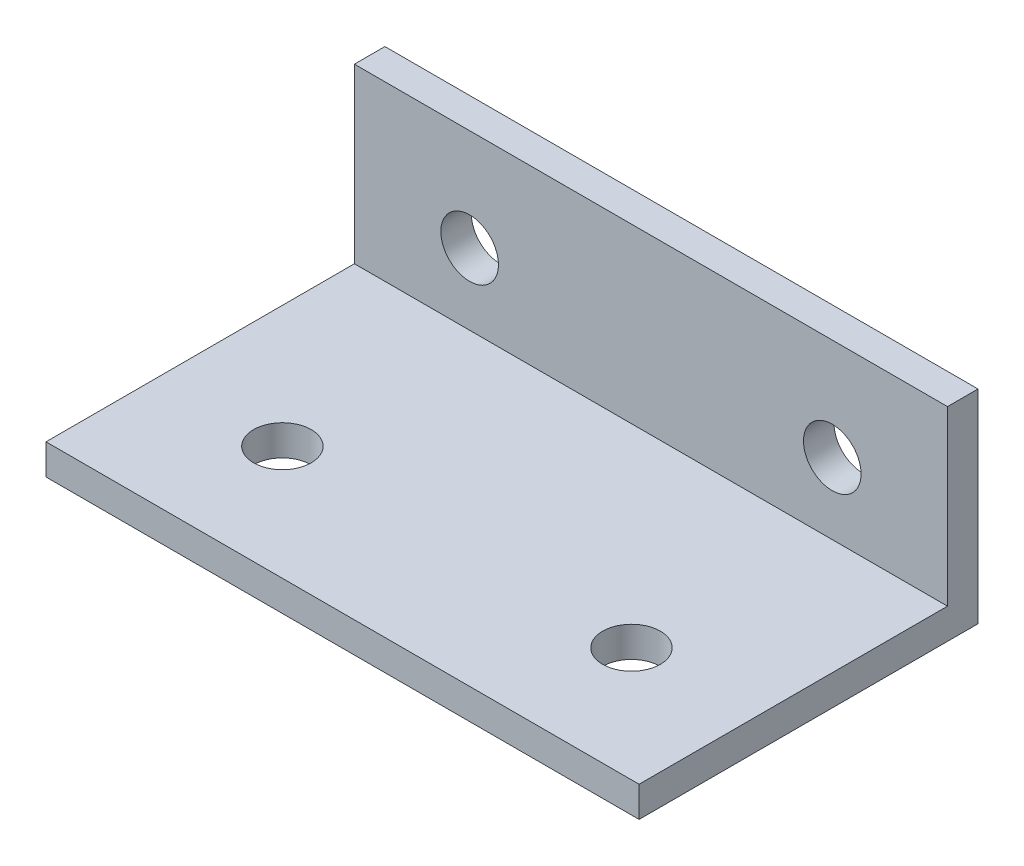
ISO-10303-21;
HEADER;
FILE_DESCRIPTION(('STEP AP214'),'2;1');
FILE_NAME('part.step','',(''),(''),'','','');
FILE_SCHEMA(('AUTOMOTIVE_DESIGN { 1 0 10303 214 1 1 1 1 }'));
ENDSEC;
DATA;
#1=APPLICATION_CONTEXT('core data for automotive mechanical design processes');
#2=APPLICATION_PROTOCOL_DEFINITION('international standard','automotive_design',2000,#1);
#3=PRODUCT_CONTEXT('',#1,'mechanical');
#4=PRODUCT('Part','Part','',(#3));
#5=PRODUCT_RELATED_PRODUCT_CATEGORY('part','',(#4));
#6=PRODUCT_DEFINITION_FORMATION('','',#4);
#7=PRODUCT_DEFINITION_CONTEXT('part definition',#1,'design');
#8=PRODUCT_DEFINITION('design','',#6,#7);
#9=PRODUCT_DEFINITION_SHAPE('','',#8);
#10=(LENGTH_UNIT() NAMED_UNIT(*) SI_UNIT(.MILLI.,.METRE.));
#11=(NAMED_UNIT(*) PLANE_ANGLE_UNIT() SI_UNIT($,.RADIAN.));
#12=(NAMED_UNIT(*) SI_UNIT($,.STERADIAN.) SOLID_ANGLE_UNIT());
#13=UNCERTAINTY_MEASURE_WITH_UNIT(LENGTH_MEASURE(1.E-05),#10,'distance_accuracy_value','');
#14=(GEOMETRIC_REPRESENTATION_CONTEXT(3) GLOBAL_UNCERTAINTY_ASSIGNED_CONTEXT((#13)) GLOBAL_UNIT_ASSIGNED_CONTEXT((#10,
#11,#12)) REPRESENTATION_CONTEXT('',''));
#15=CARTESIAN_POINT('',(0.,0.,0.));
#16=DIRECTION('',(0.,0.,1.));
#17=DIRECTION('',(1.,0.,0.));
#18=AXIS2_PLACEMENT_3D('',#15,#16,#17);
#19=CARTESIAN_POINT('',(17.5,1.8,-10.));
#20=DIRECTION('',(-1.,0.,0.));
#21=DIRECTION('',(0.,0.,1.));
#22=AXIS2_PLACEMENT_3D('',#19,#20,#21);
#23=PLANE('',#22);
#24=DIRECTION('',(0.,0.,-1.));
#25=VECTOR('',#24,1.);
#26=CARTESIAN_POINT('',(17.5,0.,-10.));
#27=LINE('',#26,#25);
#28=CARTESIAN_POINT('',(17.5,0.,10.));
#29=VERTEX_POINT('',#28);
#30=CARTESIAN_POINT('',(17.5,0.,-10.));
#31=VERTEX_POINT('',#30);
#32=EDGE_CURVE('E90',#29,#31,#27,.T.);
#33=ORIENTED_EDGE('',*,*,#32,.T.);
#34=DIRECTION('',(0.,-1.,0.));
#35=VECTOR('',#34,1.);
#36=CARTESIAN_POINT('',(17.5,1.8,-10.));
#37=LINE('',#36,#35);
#38=CARTESIAN_POINT('',(17.5,12.,-10.));
#39=VERTEX_POINT('',#38);
#40=EDGE_CURVE('E11',#39,#31,#37,.T.);
#41=ORIENTED_EDGE('',*,*,#40,.F.);
#42=DIRECTION('',(0.,0.,-1.));
#43=VECTOR('',#42,1.);
#44=CARTESIAN_POINT('',(17.5,12.,-10.));
#45=LINE('',#44,#43);
#46=CARTESIAN_POINT('',(17.5,12.,-8.2));
#47=VERTEX_POINT('',#46);
#48=EDGE_CURVE('E127',#47,#39,#45,.T.);
#49=ORIENTED_EDGE('',*,*,#48,.F.);
#50=DIRECTION('',(0.,-1.,0.));
#51=VECTOR('',#50,1.);
#52=CARTESIAN_POINT('',(17.5,12.,-8.2));
#53=LINE('',#52,#51);
#54=CARTESIAN_POINT('',(17.5,1.8,-8.2));
#55=VERTEX_POINT('',#54);
#56=EDGE_CURVE('E99',#47,#55,#53,.T.);
#57=ORIENTED_EDGE('',*,*,#56,.T.);
#58=DIRECTION('',(0.,0.,-1.));
#59=VECTOR('',#58,1.);
#60=CARTESIAN_POINT('',(17.5,1.8,-10.));
#61=LINE('',#60,#59);
#62=CARTESIAN_POINT('',(17.5,1.8,10.));
#63=VERTEX_POINT('',#62);
#64=EDGE_CURVE('E84',#63,#55,#61,.T.);
#65=ORIENTED_EDGE('',*,*,#64,.F.);
#66=DIRECTION('',(0.,-1.,0.));
#67=VECTOR('',#66,1.);
#68=CARTESIAN_POINT('',(17.5,1.8,10.));
#69=LINE('',#68,#67);
#70=EDGE_CURVE('E77',#63,#29,#69,.T.);
#71=ORIENTED_EDGE('',*,*,#70,.T.);
#72=EDGE_LOOP('',(#33,#41,#49,#57,#65,#71));
#73=FACE_BOUND('',#72,.T.);
#74=ADVANCED_FACE('F33',(#73),#23,.F.);
#75=CARTESIAN_POINT('',(-17.5,1.8,-10.));
#76=DIRECTION('',(0.,0.,1.));
#77=DIRECTION('',(1.,0.,0.));
#78=AXIS2_PLACEMENT_3D('',#75,#76,#77);
#79=PLANE('',#78);
#80=CARTESIAN_POINT('',(-10.7,6.,-10.));
#81=DIRECTION('',(0.,0.,1.));
#82=DIRECTION('',(1.,0.,0.));
#83=AXIS2_PLACEMENT_3D('',#80,#81,#82);
#84=CIRCLE('',#83,1.7);
#85=CARTESIAN_POINT('',(-9.00000000000001,6.,-10.));
#86=VERTEX_POINT('',#85);
#87=EDGE_CURVE('E144',#86,#86,#84,.T.);
#88=ORIENTED_EDGE('',*,*,#87,.T.);
#89=EDGE_LOOP('',(#88));
#90=FACE_BOUND('',#89,.T.);
#91=CARTESIAN_POINT('',(10.7,6.,-10.));
#92=DIRECTION('',(0.,0.,1.));
#93=DIRECTION('',(1.,0.,0.));
#94=AXIS2_PLACEMENT_3D('',#91,#92,#93);
#95=CIRCLE('',#94,1.7);
#96=CARTESIAN_POINT('',(12.4,6.,-10.));
#97=VERTEX_POINT('',#96);
#98=EDGE_CURVE('E120',#97,#97,#95,.T.);
#99=ORIENTED_EDGE('',*,*,#98,.T.);
#100=EDGE_LOOP('',(#99));
#101=FACE_BOUND('',#100,.T.);
#102=DIRECTION('',(-1.,0.,0.));
#103=VECTOR('',#102,1.);
#104=CARTESIAN_POINT('',(-17.5,0.,-10.));
#105=LINE('',#104,#103);
#106=CARTESIAN_POINT('',(-17.5,0.,-10.));
#107=VERTEX_POINT('',#106);
#108=EDGE_CURVE('E94',#31,#107,#105,.T.);
#109=ORIENTED_EDGE('',*,*,#108,.T.);
#110=DIRECTION('',(0.,-1.,0.));
#111=VECTOR('',#110,1.);
#112=CARTESIAN_POINT('',(-17.5,1.8,-10.));
#113=LINE('',#112,#111);
#114=CARTESIAN_POINT('',(-17.5,12.,-10.));
#115=VERTEX_POINT('',#114);
#116=EDGE_CURVE('E41',#115,#107,#113,.T.);
#117=ORIENTED_EDGE('',*,*,#116,.F.);
#118=DIRECTION('',(-1.,0.,0.));
#119=VECTOR('',#118,1.);
#120=CARTESIAN_POINT('',(-17.5,12.,-10.));
#121=LINE('',#120,#119);
#122=EDGE_CURVE('E116',#39,#115,#121,.T.);
#123=ORIENTED_EDGE('',*,*,#122,.F.);
#124=ORIENTED_EDGE('',*,*,#40,.T.);
#125=EDGE_LOOP('',(#109,#117,#123,#124));
#126=FACE_BOUND('',#125,.T.);
#127=ADVANCED_FACE('F187',(#90,#101,#126),#79,.F.);
#128=CARTESIAN_POINT('',(-17.5,1.8,-10.));
#129=DIRECTION('',(1.,0.,0.));
#130=DIRECTION('',(0.,0.,-1.));
#131=AXIS2_PLACEMENT_3D('',#128,#129,#130);
#132=PLANE('',#131);
#133=DIRECTION('',(0.,0.,1.));
#134=VECTOR('',#133,1.);
#135=CARTESIAN_POINT('',(-17.5,0.,-10.));
#136=LINE('',#135,#134);
#137=CARTESIAN_POINT('',(-17.5,0.,10.));
#138=VERTEX_POINT('',#137);
#139=EDGE_CURVE('E85',#107,#138,#136,.T.);
#140=ORIENTED_EDGE('',*,*,#139,.T.);
#141=DIRECTION('',(0.,-1.,0.));
#142=VECTOR('',#141,1.);
#143=CARTESIAN_POINT('',(-17.5,1.8,10.));
#144=LINE('',#143,#142);
#145=CARTESIAN_POINT('',(-17.5,1.8,10.));
#146=VERTEX_POINT('',#145);
#147=EDGE_CURVE('E80',#146,#138,#144,.T.);
#148=ORIENTED_EDGE('',*,*,#147,.F.);
#149=DIRECTION('',(0.,0.,1.));
#150=VECTOR('',#149,1.);
#151=CARTESIAN_POINT('',(-17.5,1.8,-10.));
#152=LINE('',#151,#150);
#153=CARTESIAN_POINT('',(-17.5,1.8,-8.2));
#154=VERTEX_POINT('',#153);
#155=EDGE_CURVE('E109',#154,#146,#152,.T.);
#156=ORIENTED_EDGE('',*,*,#155,.F.);
#157=DIRECTION('',(0.,-1.,0.));
#158=VECTOR('',#157,1.);
#159=CARTESIAN_POINT('',(-17.5,12.,-8.2));
#160=LINE('',#159,#158);
#161=CARTESIAN_POINT('',(-17.5,12.,-8.2));
#162=VERTEX_POINT('',#161);
#163=EDGE_CURVE('E95',#162,#154,#160,.T.);
#164=ORIENTED_EDGE('',*,*,#163,.F.);
#165=DIRECTION('',(0.,0.,1.));
#166=VECTOR('',#165,1.);
#167=CARTESIAN_POINT('',(-17.5,12.,-10.));
#168=LINE('',#167,#166);
#169=EDGE_CURVE('E119',#115,#162,#168,.T.);
#170=ORIENTED_EDGE('',*,*,#169,.F.);
#171=ORIENTED_EDGE('',*,*,#116,.T.);
#172=EDGE_LOOP('',(#140,#148,#156,#164,#170,#171));
#173=FACE_BOUND('',#172,.T.);
#174=ADVANCED_FACE('F191',(#173),#132,.F.);
#175=CARTESIAN_POINT('',(-17.5,1.8,10.));
#176=DIRECTION('',(0.,0.,-1.));
#177=DIRECTION('',(-1.,0.,0.));
#178=AXIS2_PLACEMENT_3D('',#175,#176,#177);
#179=PLANE('',#178);
#180=DIRECTION('',(1.,0.,0.));
#181=VECTOR('',#180,1.);
#182=CARTESIAN_POINT('',(-17.5,0.,10.));
#183=LINE('',#182,#181);
#184=EDGE_CURVE('E74',#138,#29,#183,.T.);
#185=ORIENTED_EDGE('',*,*,#184,.T.);
#186=ORIENTED_EDGE('',*,*,#70,.F.);
#187=DIRECTION('',(1.,0.,0.));
#188=VECTOR('',#187,1.);
#189=CARTESIAN_POINT('',(-17.5,1.8,10.));
#190=LINE('',#189,#188);
#191=EDGE_CURVE('E55',#146,#63,#190,.T.);
#192=ORIENTED_EDGE('',*,*,#191,.F.);
#193=ORIENTED_EDGE('',*,*,#147,.T.);
#194=EDGE_LOOP('',(#185,#186,#192,#193));
#195=FACE_BOUND('',#194,.T.);
#196=ADVANCED_FACE('F76',(#195),#179,.F.);
#197=CARTESIAN_POINT('',(0.,1.8,0.));
#198=DIRECTION('',(0.,1.,0.));
#199=DIRECTION('',(0.,0.,1.));
#200=AXIS2_PLACEMENT_3D('',#197,#198,#199);
#201=PLANE('',#200);
#202=CARTESIAN_POINT('',(-10.3,1.8,3.25));
#203=DIRECTION('',(0.,1.,0.));
#204=DIRECTION('',(0.,0.,1.));
#205=AXIS2_PLACEMENT_3D('',#202,#203,#204);
#206=CIRCLE('',#205,1.69999999999999);
#207=CARTESIAN_POINT('',(-10.3,1.8,4.94999999999999));
#208=VERTEX_POINT('',#207);
#209=EDGE_CURVE('E159',#208,#208,#206,.T.);
#210=ORIENTED_EDGE('',*,*,#209,.F.);
#211=EDGE_LOOP('',(#210));
#212=FACE_BOUND('',#211,.T.);
#213=CARTESIAN_POINT('',(10.3,1.8,3.25));
#214=DIRECTION('',(0.,1.,0.));
#215=DIRECTION('',(0.,0.,1.));
#216=AXIS2_PLACEMENT_3D('',#213,#214,#215);
#217=CIRCLE('',#216,1.69999999999999);
#218=CARTESIAN_POINT('',(10.3,1.8,4.94999999999999));
#219=VERTEX_POINT('',#218);
#220=EDGE_CURVE('E153',#219,#219,#217,.T.);
#221=ORIENTED_EDGE('',*,*,#220,.F.);
#222=EDGE_LOOP('',(#221));
#223=FACE_BOUND('',#222,.T.);
#224=DIRECTION('',(1.,0.,0.));
#225=VECTOR('',#224,1.);
#226=CARTESIAN_POINT('',(-17.5,1.8,-8.2));
#227=LINE('',#226,#225);
#228=EDGE_CURVE('E49',#154,#55,#227,.T.);
#229=ORIENTED_EDGE('',*,*,#228,.F.);
#230=ORIENTED_EDGE('',*,*,#155,.T.);
#231=ORIENTED_EDGE('',*,*,#191,.T.);
#232=ORIENTED_EDGE('',*,*,#64,.T.);
#233=EDGE_LOOP('',(#229,#230,#231,#232));
#234=FACE_BOUND('',#233,.T.);
#235=ADVANCED_FACE('F165',(#212,#223,#234),#201,.T.);
#236=CARTESIAN_POINT('',(0.,0.,0.));
#237=DIRECTION('',(0.,1.,0.));
#238=DIRECTION('',(0.,0.,1.));
#239=AXIS2_PLACEMENT_3D('',#236,#237,#238);
#240=PLANE('',#239);
#241=CARTESIAN_POINT('',(-10.3,0.,3.25));
#242=DIRECTION('',(0.,1.,0.));
#243=DIRECTION('',(0.,0.,1.));
#244=AXIS2_PLACEMENT_3D('',#241,#242,#243);
#245=CIRCLE('',#244,1.7);
#246=CARTESIAN_POINT('',(-10.3,0.,4.95));
#247=VERTEX_POINT('',#246);
#248=EDGE_CURVE('E156',#247,#247,#245,.T.);
#249=ORIENTED_EDGE('',*,*,#248,.T.);
#250=EDGE_LOOP('',(#249));
#251=FACE_BOUND('',#250,.T.);
#252=CARTESIAN_POINT('',(10.3,0.,3.25));
#253=DIRECTION('',(0.,1.,0.));
#254=DIRECTION('',(0.,0.,1.));
#255=AXIS2_PLACEMENT_3D('',#252,#253,#254);
#256=CIRCLE('',#255,1.7);
#257=CARTESIAN_POINT('',(10.3,0.,4.95));
#258=VERTEX_POINT('',#257);
#259=EDGE_CURVE('E150',#258,#258,#256,.T.);
#260=ORIENTED_EDGE('',*,*,#259,.T.);
#261=EDGE_LOOP('',(#260));
#262=FACE_BOUND('',#261,.T.);
#263=ORIENTED_EDGE('',*,*,#32,.F.);
#264=ORIENTED_EDGE('',*,*,#184,.F.);
#265=ORIENTED_EDGE('',*,*,#139,.F.);
#266=ORIENTED_EDGE('',*,*,#108,.F.);
#267=EDGE_LOOP('',(#263,#264,#265,#266));
#268=FACE_BOUND('',#267,.T.);
#269=ADVANCED_FACE('F93',(#251,#262,#268),#240,.F.);
#270=CARTESIAN_POINT('',(-17.5,12.,-8.2));
#271=DIRECTION('',(0.,0.,-1.));
#272=DIRECTION('',(-1.,0.,0.));
#273=AXIS2_PLACEMENT_3D('',#270,#271,#272);
#274=PLANE('',#273);
#275=CARTESIAN_POINT('',(-10.7,6.,-8.2));
#276=DIRECTION('',(0.,0.,1.));
#277=DIRECTION('',(1.,0.,0.));
#278=AXIS2_PLACEMENT_3D('',#275,#276,#277);
#279=CIRCLE('',#278,1.7);
#280=CARTESIAN_POINT('',(-9.00000000000001,6.,-8.2));
#281=VERTEX_POINT('',#280);
#282=EDGE_CURVE('E147',#281,#281,#279,.T.);
#283=ORIENTED_EDGE('',*,*,#282,.F.);
#284=EDGE_LOOP('',(#283));
#285=FACE_BOUND('',#284,.T.);
#286=CARTESIAN_POINT('',(10.7,6.,-8.2));
#287=DIRECTION('',(0.,0.,1.));
#288=DIRECTION('',(1.,0.,0.));
#289=AXIS2_PLACEMENT_3D('',#286,#287,#288);
#290=CIRCLE('',#289,1.7);
#291=CARTESIAN_POINT('',(12.4,6.,-8.2));
#292=VERTEX_POINT('',#291);
#293=EDGE_CURVE('E141',#292,#292,#290,.T.);
#294=ORIENTED_EDGE('',*,*,#293,.F.);
#295=EDGE_LOOP('',(#294));
#296=FACE_BOUND('',#295,.T.);
#297=ORIENTED_EDGE('',*,*,#228,.T.);
#298=ORIENTED_EDGE('',*,*,#56,.F.);
#299=DIRECTION('',(1.,0.,0.));
#300=VECTOR('',#299,1.);
#301=CARTESIAN_POINT('',(-17.5,12.,-8.2));
#302=LINE('',#301,#300);
#303=EDGE_CURVE('E133',#162,#47,#302,.T.);
#304=ORIENTED_EDGE('',*,*,#303,.F.);
#305=ORIENTED_EDGE('',*,*,#163,.T.);
#306=EDGE_LOOP('',(#297,#298,#304,#305));
#307=FACE_BOUND('',#306,.T.);
#308=ADVANCED_FACE('F203',(#285,#296,#307),#274,.F.);
#309=CARTESIAN_POINT('',(0.,12.,0.));
#310=DIRECTION('',(0.,1.,0.));
#311=DIRECTION('',(0.,0.,1.));
#312=AXIS2_PLACEMENT_3D('',#309,#310,#311);
#313=PLANE('',#312);
#314=ORIENTED_EDGE('',*,*,#169,.T.);
#315=ORIENTED_EDGE('',*,*,#303,.T.);
#316=ORIENTED_EDGE('',*,*,#48,.T.);
#317=ORIENTED_EDGE('',*,*,#122,.T.);
#318=EDGE_LOOP('',(#314,#315,#316,#317));
#319=FACE_BOUND('',#318,.T.);
#320=ADVANCED_FACE('F208',(#319),#313,.T.);
#321=CARTESIAN_POINT('',(10.7,6.,-8.2));
#322=DIRECTION('',(0.,0.,1.));
#323=DIRECTION('',(1.,0.,0.));
#324=AXIS2_PLACEMENT_3D('',#321,#322,#323);
#325=CYLINDRICAL_SURFACE('',#324,1.7);
#326=ORIENTED_EDGE('',*,*,#98,.F.);
#327=EDGE_LOOP('',(#326));
#328=FACE_BOUND('',#327,.T.);
#329=ORIENTED_EDGE('',*,*,#293,.T.);
#330=EDGE_LOOP('',(#329));
#331=FACE_BOUND('',#330,.T.);
#332=ADVANCED_FACE('F182',(#328,#331),#325,.F.);
#333=CARTESIAN_POINT('',(-10.7,6.,-8.2));
#334=DIRECTION('',(0.,0.,1.));
#335=DIRECTION('',(1.,0.,0.));
#336=AXIS2_PLACEMENT_3D('',#333,#334,#335);
#337=CYLINDRICAL_SURFACE('',#336,1.7);
#338=ORIENTED_EDGE('',*,*,#87,.F.);
#339=EDGE_LOOP('',(#338));
#340=FACE_BOUND('',#339,.T.);
#341=ORIENTED_EDGE('',*,*,#282,.T.);
#342=EDGE_LOOP('',(#341));
#343=FACE_BOUND('',#342,.T.);
#344=ADVANCED_FACE('F173',(#340,#343),#337,.F.);
#345=CARTESIAN_POINT('',(10.3,1.8,3.25));
#346=DIRECTION('',(0.,1.,0.));
#347=DIRECTION('',(0.,0.,1.));
#348=AXIS2_PLACEMENT_3D('',#345,#346,#347);
#349=CYLINDRICAL_SURFACE('',#348,1.69999999999999);
#350=ORIENTED_EDGE('',*,*,#259,.F.);
#351=EDGE_LOOP('',(#350));
#352=FACE_BOUND('',#351,.T.);
#353=ORIENTED_EDGE('',*,*,#220,.T.);
#354=EDGE_LOOP('',(#353));
#355=FACE_BOUND('',#354,.T.);
#356=ADVANCED_FACE('F171',(#352,#355),#349,.F.);
#357=CARTESIAN_POINT('',(-10.3,1.8,3.25));
#358=DIRECTION('',(0.,1.,0.));
#359=DIRECTION('',(0.,0.,1.));
#360=AXIS2_PLACEMENT_3D('',#357,#358,#359);
#361=CYLINDRICAL_SURFACE('',#360,1.69999999999999);
#362=ORIENTED_EDGE('',*,*,#248,.F.);
#363=EDGE_LOOP('',(#362));
#364=FACE_BOUND('',#363,.T.);
#365=ORIENTED_EDGE('',*,*,#209,.T.);
#366=EDGE_LOOP('',(#365));
#367=FACE_BOUND('',#366,.T.);
#368=ADVANCED_FACE('F163',(#364,#367),#361,.F.);
#369=CLOSED_SHELL('',(#74,#127,#174,#196,#235,#269,#308,#320,#332,#344,#356,#368));
#370=MANIFOLD_SOLID_BREP('B2',#369);
#371=ADVANCED_BREP_SHAPE_REPRESENTATION('',(#18,#370),#14);
#372=SHAPE_DEFINITION_REPRESENTATION(#9,#371);
ENDSEC;
END-ISO-10303-21;
